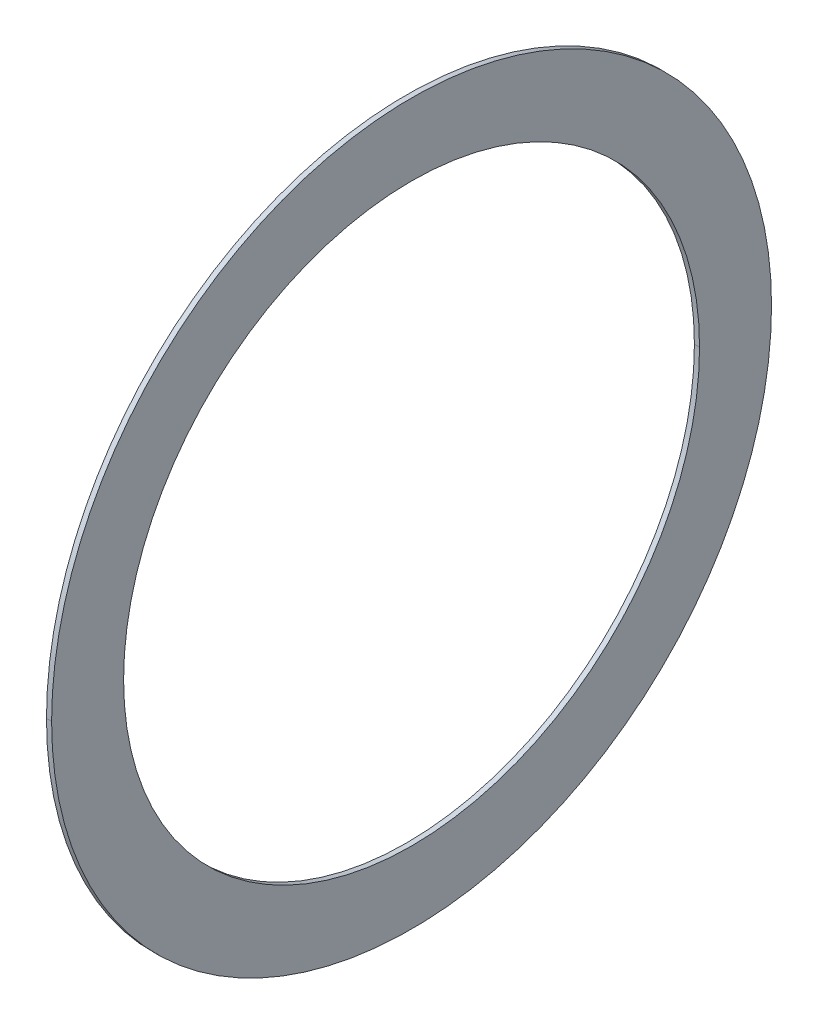
ISO-10303-21;
HEADER;
FILE_DESCRIPTION(('STEP AP214'),'2;1');
FILE_NAME('part.step','',(''),(''),'','','');
FILE_SCHEMA(('AUTOMOTIVE_DESIGN { 1 0 10303 214 1 1 1 1 }'));
ENDSEC;
DATA;
#1=APPLICATION_CONTEXT('core data for automotive mechanical design processes');
#2=APPLICATION_PROTOCOL_DEFINITION('international standard','automotive_design',2000,#1);
#3=PRODUCT_CONTEXT('',#1,'mechanical');
#4=PRODUCT('Part','Part','',(#3));
#5=PRODUCT_RELATED_PRODUCT_CATEGORY('part','',(#4));
#6=PRODUCT_DEFINITION_FORMATION('','',#4);
#7=PRODUCT_DEFINITION_CONTEXT('part definition',#1,'design');
#8=PRODUCT_DEFINITION('design','',#6,#7);
#9=PRODUCT_DEFINITION_SHAPE('','',#8);
#10=(LENGTH_UNIT() NAMED_UNIT(*) SI_UNIT(.MILLI.,.METRE.));
#11=(NAMED_UNIT(*) PLANE_ANGLE_UNIT() SI_UNIT($,.RADIAN.));
#12=(NAMED_UNIT(*) SI_UNIT($,.STERADIAN.) SOLID_ANGLE_UNIT());
#13=UNCERTAINTY_MEASURE_WITH_UNIT(LENGTH_MEASURE(1.E-05),#10,'distance_accuracy_value','');
#14=(GEOMETRIC_REPRESENTATION_CONTEXT(3) GLOBAL_UNCERTAINTY_ASSIGNED_CONTEXT((#13)) GLOBAL_UNIT_ASSIGNED_CONTEXT((#10,
#11,#12)) REPRESENTATION_CONTEXT('',''));
#15=CARTESIAN_POINT('',(0.,0.,0.));
#16=DIRECTION('',(0.,0.,1.));
#17=DIRECTION('',(1.,0.,0.));
#18=AXIS2_PLACEMENT_3D('',#15,#16,#17);
#19=CARTESIAN_POINT('',(0.,29.,0.));
#20=DIRECTION('',(-1.,0.,0.));
#21=DIRECTION('',(0.,0.,1.));
#22=AXIS2_PLACEMENT_3D('',#19,#20,#21);
#23=PLANE('',#22);
#24=CARTESIAN_POINT('',(0.,0.,0.));
#25=DIRECTION('',(1.,0.,0.));
#26=DIRECTION('',(0.,0.,-1.));
#27=AXIS2_PLACEMENT_3D('',#24,#25,#26);
#28=CIRCLE('',#27,23.2);
#29=CARTESIAN_POINT('',(0.,0.,-23.2));
#30=VERTEX_POINT('',#29);
#31=CARTESIAN_POINT('',(0.,0.,23.2));
#32=VERTEX_POINT('',#31);
#33=EDGE_CURVE('E11',#30,#32,#28,.T.);
#34=ORIENTED_EDGE('',*,*,#33,.T.);
#35=CARTESIAN_POINT('',(0.,0.,0.));
#36=DIRECTION('',(1.,0.,0.));
#37=DIRECTION('',(0.,0.,-1.));
#38=AXIS2_PLACEMENT_3D('',#35,#36,#37);
#39=CIRCLE('',#38,23.2);
#40=EDGE_CURVE('E25',#32,#30,#39,.T.);
#41=ORIENTED_EDGE('',*,*,#40,.T.);
#42=EDGE_LOOP('',(#34,#41));
#43=FACE_BOUND('',#42,.T.);
#44=CARTESIAN_POINT('',(0.,0.,0.));
#45=DIRECTION('',(1.,0.,0.));
#46=DIRECTION('',(0.,0.,-1.));
#47=AXIS2_PLACEMENT_3D('',#44,#45,#46);
#48=CIRCLE('',#47,29.);
#49=CARTESIAN_POINT('',(0.,0.,29.));
#50=VERTEX_POINT('',#49);
#51=CARTESIAN_POINT('',(0.,0.,-29.));
#52=VERTEX_POINT('',#51);
#53=EDGE_CURVE('E95',#50,#52,#48,.T.);
#54=ORIENTED_EDGE('',*,*,#53,.F.);
#55=CARTESIAN_POINT('',(0.,0.,0.));
#56=DIRECTION('',(1.,0.,0.));
#57=DIRECTION('',(0.,0.,-1.));
#58=AXIS2_PLACEMENT_3D('',#55,#56,#57);
#59=CIRCLE('',#58,29.);
#60=EDGE_CURVE('E90',#52,#50,#59,.T.);
#61=ORIENTED_EDGE('',*,*,#60,.F.);
#62=EDGE_LOOP('',(#54,#61));
#63=FACE_BOUND('',#62,.T.);
#64=ADVANCED_FACE('F17',(#43,#63),#23,.T.);
#65=CARTESIAN_POINT('',(0.414,0.,0.));
#66=DIRECTION('',(1.,0.,0.));
#67=DIRECTION('',(0.,-1.,0.));
#68=AXIS2_PLACEMENT_3D('',#65,#66,#67);
#69=CYLINDRICAL_SURFACE('',#68,29.);
#70=DIRECTION('',(1.,0.,0.));
#71=VECTOR('',#70,1.);
#72=CARTESIAN_POINT('',(0.,0.,29.));
#73=LINE('',#72,#71);
#74=CARTESIAN_POINT('',(0.414,0.,29.));
#75=VERTEX_POINT('',#74);
#76=EDGE_CURVE('E86',#50,#75,#73,.T.);
#77=ORIENTED_EDGE('',*,*,#76,.T.);
#78=CARTESIAN_POINT('',(0.414,0.,0.));
#79=DIRECTION('',(1.,0.,0.));
#80=DIRECTION('',(0.,0.,-1.));
#81=AXIS2_PLACEMENT_3D('',#78,#79,#80);
#82=CIRCLE('',#81,29.);
#83=CARTESIAN_POINT('',(0.414,0.,-29.));
#84=VERTEX_POINT('',#83);
#85=EDGE_CURVE('E81',#84,#75,#82,.T.);
#86=ORIENTED_EDGE('',*,*,#85,.F.);
#87=DIRECTION('',(1.,0.,0.));
#88=VECTOR('',#87,1.);
#89=CARTESIAN_POINT('',(0.,0.,-29.));
#90=LINE('',#89,#88);
#91=EDGE_CURVE('E70',#52,#84,#90,.T.);
#92=ORIENTED_EDGE('',*,*,#91,.F.);
#93=ORIENTED_EDGE('',*,*,#60,.T.);
#94=EDGE_LOOP('',(#77,#86,#92,#93));
#95=FACE_BOUND('',#94,.T.);
#96=ADVANCED_FACE('F111',(#95),#69,.T.);
#97=CARTESIAN_POINT('',(0.414,0.,0.));
#98=DIRECTION('',(1.,0.,0.));
#99=DIRECTION('',(0.,1.,0.));
#100=AXIS2_PLACEMENT_3D('',#97,#98,#99);
#101=CYLINDRICAL_SURFACE('',#100,29.);
#102=ORIENTED_EDGE('',*,*,#76,.F.);
#103=ORIENTED_EDGE('',*,*,#53,.T.);
#104=ORIENTED_EDGE('',*,*,#91,.T.);
#105=CARTESIAN_POINT('',(0.414,0.,0.));
#106=DIRECTION('',(1.,0.,0.));
#107=DIRECTION('',(0.,0.,-1.));
#108=AXIS2_PLACEMENT_3D('',#105,#106,#107);
#109=CIRCLE('',#108,29.);
#110=EDGE_CURVE('E67',#75,#84,#109,.T.);
#111=ORIENTED_EDGE('',*,*,#110,.F.);
#112=EDGE_LOOP('',(#102,#103,#104,#111));
#113=FACE_BOUND('',#112,.T.);
#114=ADVANCED_FACE('F106',(#113),#101,.T.);
#115=CARTESIAN_POINT('',(0.414,23.2,0.));
#116=DIRECTION('',(1.,0.,0.));
#117=DIRECTION('',(0.,0.,-1.));
#118=AXIS2_PLACEMENT_3D('',#115,#116,#117);
#119=PLANE('',#118);
#120=ORIENTED_EDGE('',*,*,#85,.T.);
#121=ORIENTED_EDGE('',*,*,#110,.T.);
#122=EDGE_LOOP('',(#120,#121));
#123=FACE_BOUND('',#122,.T.);
#124=CARTESIAN_POINT('',(0.414,0.,0.));
#125=DIRECTION('',(1.,0.,0.));
#126=DIRECTION('',(0.,0.,-1.));
#127=AXIS2_PLACEMENT_3D('',#124,#125,#126);
#128=CIRCLE('',#127,23.2);
#129=CARTESIAN_POINT('',(0.414,0.,23.2));
#130=VERTEX_POINT('',#129);
#131=CARTESIAN_POINT('',(0.414,0.,-23.2));
#132=VERTEX_POINT('',#131);
#133=EDGE_CURVE('E55',#130,#132,#128,.T.);
#134=ORIENTED_EDGE('',*,*,#133,.F.);
#135=CARTESIAN_POINT('',(0.414,0.,0.));
#136=DIRECTION('',(1.,0.,0.));
#137=DIRECTION('',(0.,0.,-1.));
#138=AXIS2_PLACEMENT_3D('',#135,#136,#137);
#139=CIRCLE('',#138,23.2);
#140=EDGE_CURVE('E51',#132,#130,#139,.T.);
#141=ORIENTED_EDGE('',*,*,#140,.F.);
#142=EDGE_LOOP('',(#134,#141));
#143=FACE_BOUND('',#142,.T.);
#144=ADVANCED_FACE('F53',(#123,#143),#119,.T.);
#145=CARTESIAN_POINT('',(0.414,0.,0.));
#146=DIRECTION('',(1.,0.,0.));
#147=DIRECTION('',(0.,-1.,0.));
#148=AXIS2_PLACEMENT_3D('',#145,#146,#147);
#149=CYLINDRICAL_SURFACE('',#148,23.2);
#150=DIRECTION('',(1.,0.,0.));
#151=VECTOR('',#150,1.);
#152=CARTESIAN_POINT('',(0.,0.,23.2));
#153=LINE('',#152,#151);
#154=EDGE_CURVE('E59',#32,#130,#153,.T.);
#155=ORIENTED_EDGE('',*,*,#154,.F.);
#156=ORIENTED_EDGE('',*,*,#33,.F.);
#157=DIRECTION('',(1.,0.,0.));
#158=VECTOR('',#157,1.);
#159=CARTESIAN_POINT('',(0.,0.,-23.2));
#160=LINE('',#159,#158);
#161=EDGE_CURVE('E62',#30,#132,#160,.T.);
#162=ORIENTED_EDGE('',*,*,#161,.T.);
#163=ORIENTED_EDGE('',*,*,#140,.T.);
#164=EDGE_LOOP('',(#155,#156,#162,#163));
#165=FACE_BOUND('',#164,.T.);
#166=ADVANCED_FACE('F63',(#165),#149,.F.);
#167=CARTESIAN_POINT('',(0.414,0.,0.));
#168=DIRECTION('',(1.,0.,0.));
#169=DIRECTION('',(0.,1.,0.));
#170=AXIS2_PLACEMENT_3D('',#167,#168,#169);
#171=CYLINDRICAL_SURFACE('',#170,23.2);
#172=ORIENTED_EDGE('',*,*,#154,.T.);
#173=ORIENTED_EDGE('',*,*,#133,.T.);
#174=ORIENTED_EDGE('',*,*,#161,.F.);
#175=ORIENTED_EDGE('',*,*,#40,.F.);
#176=EDGE_LOOP('',(#172,#173,#174,#175));
#177=FACE_BOUND('',#176,.T.);
#178=ADVANCED_FACE('F66',(#177),#171,.F.);
#179=CLOSED_SHELL('',(#64,#96,#114,#144,#166,#178));
#180=MANIFOLD_SOLID_BREP('B1',#179);
#181=ADVANCED_BREP_SHAPE_REPRESENTATION('',(#18,#180),#14);
#182=SHAPE_DEFINITION_REPRESENTATION(#9,#181);
ENDSEC;
END-ISO-10303-21;
